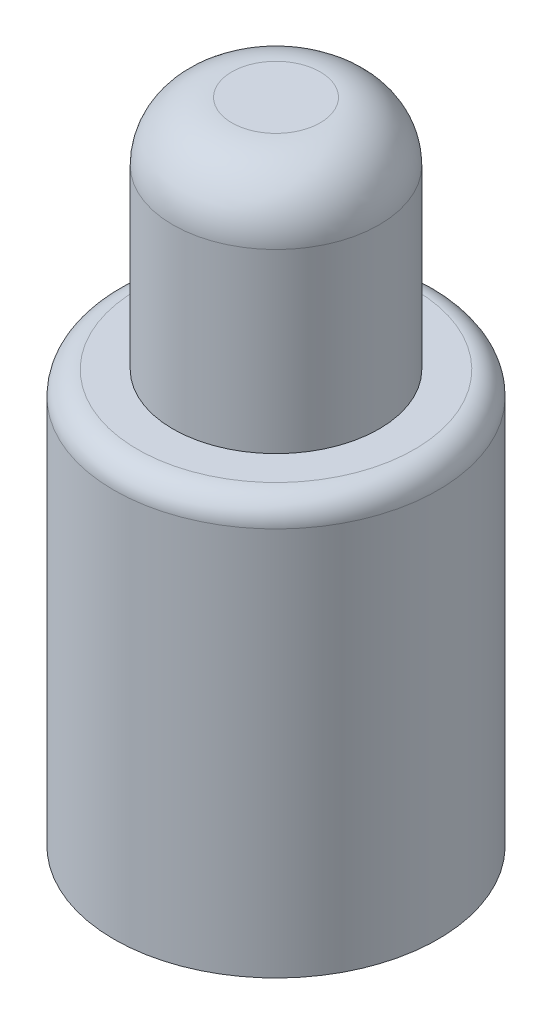
ISO-10303-21;
HEADER;
FILE_DESCRIPTION(('STEP AP214'),'2;1');
FILE_NAME('part.step','',(''),(''),'','','');
FILE_SCHEMA(('AUTOMOTIVE_DESIGN { 1 0 10303 214 1 1 1 1 }'));
ENDSEC;
DATA;
#1=APPLICATION_CONTEXT('core data for automotive mechanical design processes');
#2=APPLICATION_PROTOCOL_DEFINITION('international standard','automotive_design',2000,#1);
#3=PRODUCT_CONTEXT('',#1,'mechanical');
#4=PRODUCT('Part','Part','',(#3));
#5=PRODUCT_RELATED_PRODUCT_CATEGORY('part','',(#4));
#6=PRODUCT_DEFINITION_FORMATION('','',#4);
#7=PRODUCT_DEFINITION_CONTEXT('part definition',#1,'design');
#8=PRODUCT_DEFINITION('design','',#6,#7);
#9=PRODUCT_DEFINITION_SHAPE('','',#8);
#10=(LENGTH_UNIT() NAMED_UNIT(*) SI_UNIT(.MILLI.,.METRE.));
#11=(NAMED_UNIT(*) PLANE_ANGLE_UNIT() SI_UNIT($,.RADIAN.));
#12=(NAMED_UNIT(*) SI_UNIT($,.STERADIAN.) SOLID_ANGLE_UNIT());
#13=UNCERTAINTY_MEASURE_WITH_UNIT(LENGTH_MEASURE(1.E-05),#10,'distance_accuracy_value','');
#14=(GEOMETRIC_REPRESENTATION_CONTEXT(3) GLOBAL_UNCERTAINTY_ASSIGNED_CONTEXT((#13)) GLOBAL_UNIT_ASSIGNED_CONTEXT((#10,
#11,#12)) REPRESENTATION_CONTEXT('',''));
#15=CARTESIAN_POINT('',(0.,0.,0.));
#16=DIRECTION('',(0.,0.,1.));
#17=DIRECTION('',(1.,0.,0.));
#18=AXIS2_PLACEMENT_3D('',#15,#16,#17);
#19=CARTESIAN_POINT('',(0.,0.,0.));
#20=DIRECTION('',(0.,1.,0.));
#21=DIRECTION('',(0.,0.,1.));
#22=AXIS2_PLACEMENT_3D('',#19,#20,#21);
#23=PLANE('',#22);
#24=CARTESIAN_POINT('',(0.,0.,0.));
#25=DIRECTION('',(0.,1.,0.));
#26=DIRECTION('',(0.,0.,1.));
#27=AXIS2_PLACEMENT_3D('',#24,#25,#26);
#28=CIRCLE('',#27,2.75);
#29=CARTESIAN_POINT('',(0.,0.,2.75));
#30=VERTEX_POINT('',#29);
#31=EDGE_CURVE('E59',#30,#30,#28,.T.);
#32=ORIENTED_EDGE('',*,*,#31,.F.);
#33=EDGE_LOOP('',(#32));
#34=FACE_BOUND('',#33,.T.);
#35=ADVANCED_FACE('F39',(#34),#23,.F.);
#36=CARTESIAN_POINT('',(0.,0.,0.));
#37=DIRECTION('',(0.,1.,0.));
#38=DIRECTION('',(0.,0.,1.));
#39=AXIS2_PLACEMENT_3D('',#36,#37,#38);
#40=CYLINDRICAL_SURFACE('',#39,2.75);
#41=CARTESIAN_POINT('',(0.,6.6,0.));
#42=DIRECTION('',(0.,-1.,0.));
#43=DIRECTION('',(0.,0.,-1.));
#44=AXIS2_PLACEMENT_3D('',#41,#42,#43);
#45=CIRCLE('',#44,2.75);
#46=CARTESIAN_POINT('',(0.,6.6,-2.75));
#47=VERTEX_POINT('',#46);
#48=EDGE_CURVE('E10',#47,#47,#45,.T.);
#49=ORIENTED_EDGE('',*,*,#48,.T.);
#50=EDGE_LOOP('',(#49));
#51=FACE_BOUND('',#50,.T.);
#52=ORIENTED_EDGE('',*,*,#31,.T.);
#53=EDGE_LOOP('',(#52));
#54=FACE_BOUND('',#53,.T.);
#55=ADVANCED_FACE('F70',(#51,#54),#40,.T.);
#56=CARTESIAN_POINT('',(2.75,7.,0.));
#57=DIRECTION('',(0.,-1.,0.));
#58=DIRECTION('',(0.,0.,-1.));
#59=AXIS2_PLACEMENT_3D('',#56,#57,#58);
#60=PLANE('',#59);
#61=CARTESIAN_POINT('',(0.,7.,0.));
#62=DIRECTION('',(0.,-1.,0.));
#63=DIRECTION('',(0.,0.,-1.));
#64=AXIS2_PLACEMENT_3D('',#61,#62,#63);
#65=CIRCLE('',#64,2.35);
#66=CARTESIAN_POINT('',(0.,7.,-2.35));
#67=VERTEX_POINT('',#66);
#68=EDGE_CURVE('E46',#67,#67,#65,.F.);
#69=ORIENTED_EDGE('',*,*,#68,.T.);
#70=EDGE_LOOP('',(#69));
#71=FACE_BOUND('',#70,.T.);
#72=CARTESIAN_POINT('',(0.,7.,0.));
#73=DIRECTION('',(0.,1.,0.));
#74=DIRECTION('',(0.,0.,1.));
#75=AXIS2_PLACEMENT_3D('',#72,#73,#74);
#76=CIRCLE('',#75,1.75);
#77=CARTESIAN_POINT('',(0.,7.,1.75));
#78=VERTEX_POINT('',#77);
#79=EDGE_CURVE('E62',#78,#78,#76,.T.);
#80=ORIENTED_EDGE('',*,*,#79,.F.);
#81=EDGE_LOOP('',(#80));
#82=FACE_BOUND('',#81,.T.);
#83=ADVANCED_FACE('F68',(#71,#82),#60,.F.);
#84=CARTESIAN_POINT('',(0.,0.,0.));
#85=DIRECTION('',(0.,1.,0.));
#86=DIRECTION('',(0.,0.,1.));
#87=AXIS2_PLACEMENT_3D('',#84,#85,#86);
#88=CYLINDRICAL_SURFACE('',#87,1.75);
#89=CARTESIAN_POINT('',(0.,10.,0.));
#90=DIRECTION('',(0.,-1.,0.));
#91=DIRECTION('',(0.,0.,-1.));
#92=AXIS2_PLACEMENT_3D('',#89,#90,#91);
#93=CIRCLE('',#92,1.75);
#94=CARTESIAN_POINT('',(0.,10.,-1.75));
#95=VERTEX_POINT('',#94);
#96=EDGE_CURVE('E50',#95,#95,#93,.T.);
#97=ORIENTED_EDGE('',*,*,#96,.T.);
#98=EDGE_LOOP('',(#97));
#99=FACE_BOUND('',#98,.T.);
#100=ORIENTED_EDGE('',*,*,#79,.T.);
#101=EDGE_LOOP('',(#100));
#102=FACE_BOUND('',#101,.T.);
#103=ADVANCED_FACE('F66',(#99,#102),#88,.T.);
#104=CARTESIAN_POINT('',(1.75,11.,0.));
#105=DIRECTION('',(0.,-1.,0.));
#106=DIRECTION('',(0.,0.,-1.));
#107=AXIS2_PLACEMENT_3D('',#104,#105,#106);
#108=PLANE('',#107);
#109=CARTESIAN_POINT('',(0.,11.,0.));
#110=DIRECTION('',(0.,-1.,0.));
#111=DIRECTION('',(0.,0.,-1.));
#112=AXIS2_PLACEMENT_3D('',#109,#110,#111);
#113=CIRCLE('',#112,0.75);
#114=CARTESIAN_POINT('',(0.,11.,-0.75));
#115=VERTEX_POINT('',#114);
#116=EDGE_CURVE('E54',#115,#115,#113,.F.);
#117=ORIENTED_EDGE('',*,*,#116,.T.);
#118=EDGE_LOOP('',(#117));
#119=FACE_BOUND('',#118,.T.);
#120=ADVANCED_FACE('F76',(#119),#108,.F.);
#121=CARTESIAN_POINT('',(0.,10.,0.));
#122=DIRECTION('',(0.,-1.,0.));
#123=DIRECTION('',(0.,0.,-1.));
#124=AXIS2_PLACEMENT_3D('',#121,#122,#123);
#125=DEGENERATE_TOROIDAL_SURFACE('',#124,0.75,1.,.T.);
#126=ORIENTED_EDGE('',*,*,#96,.F.);
#127=EDGE_LOOP('',(#126));
#128=FACE_BOUND('',#127,.T.);
#129=ORIENTED_EDGE('',*,*,#116,.F.);
#130=EDGE_LOOP('',(#129));
#131=FACE_BOUND('',#130,.T.);
#132=ADVANCED_FACE('F86',(#128,#131),#125,.T.);
#133=CARTESIAN_POINT('',(0.,6.6,0.));
#134=DIRECTION('',(0.,-1.,0.));
#135=DIRECTION('',(0.,0.,-1.));
#136=AXIS2_PLACEMENT_3D('',#133,#134,#135);
#137=TOROIDAL_SURFACE('',#136,2.35,0.4);
#138=ORIENTED_EDGE('',*,*,#48,.F.);
#139=EDGE_LOOP('',(#138));
#140=FACE_BOUND('',#139,.T.);
#141=ORIENTED_EDGE('',*,*,#68,.F.);
#142=EDGE_LOOP('',(#141));
#143=FACE_BOUND('',#142,.T.);
#144=ADVANCED_FACE('F41',(#140,#143),#137,.T.);
#145=CLOSED_SHELL('',(#35,#55,#83,#103,#120,#132,#144));
#146=MANIFOLD_SOLID_BREP('B2',#145);
#147=ADVANCED_BREP_SHAPE_REPRESENTATION('',(#18,#146),#14);
#148=SHAPE_DEFINITION_REPRESENTATION(#9,#147);
ENDSEC;
END-ISO-10303-21;
